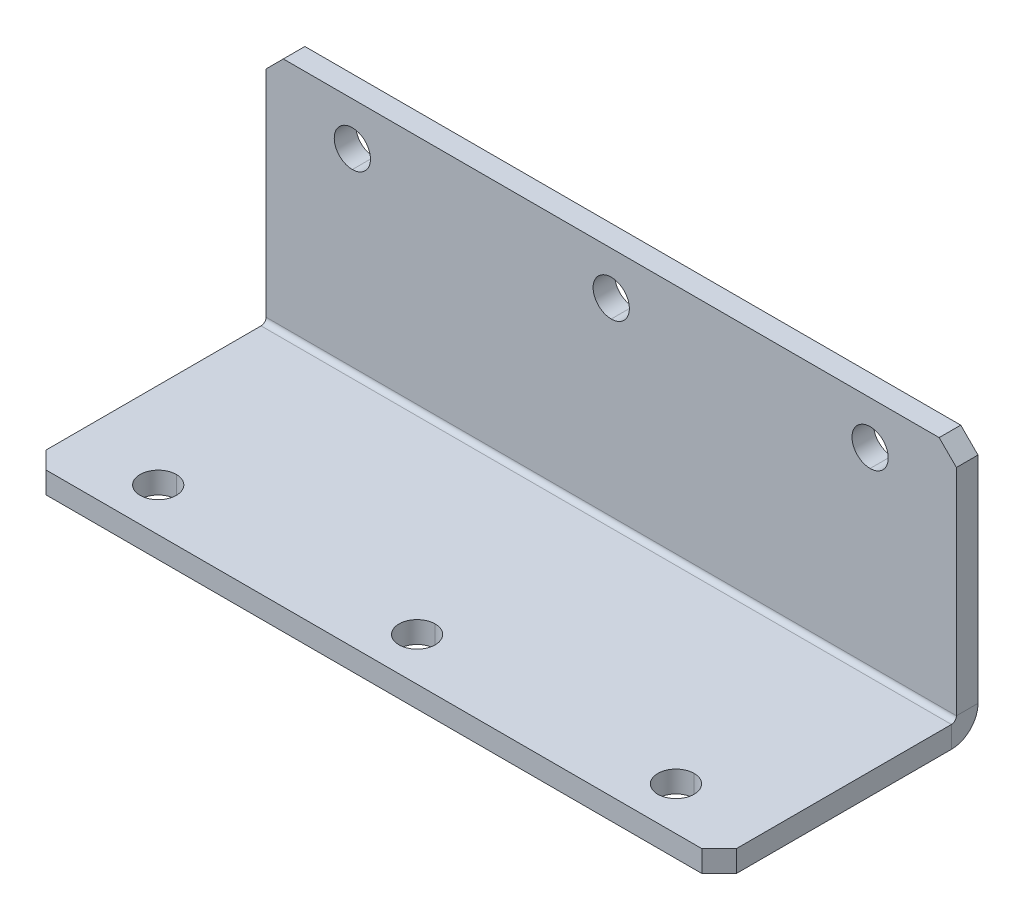
ISO-10303-21;
HEADER;
FILE_DESCRIPTION(('STEP AP214'),'2;1');
FILE_NAME('part.step','',(''),(''),'','','');
FILE_SCHEMA(('AUTOMOTIVE_DESIGN { 1 0 10303 214 1 1 1 1 }'));
ENDSEC;
DATA;
#1=APPLICATION_CONTEXT('core data for automotive mechanical design processes');
#2=APPLICATION_PROTOCOL_DEFINITION('international standard','automotive_design',2000,#1);
#3=PRODUCT_CONTEXT('',#1,'mechanical');
#4=PRODUCT('Part','Part','',(#3));
#5=PRODUCT_RELATED_PRODUCT_CATEGORY('part','',(#4));
#6=PRODUCT_DEFINITION_FORMATION('','',#4);
#7=PRODUCT_DEFINITION_CONTEXT('part definition',#1,'design');
#8=PRODUCT_DEFINITION('design','',#6,#7);
#9=PRODUCT_DEFINITION_SHAPE('','',#8);
#10=(LENGTH_UNIT() NAMED_UNIT(*) SI_UNIT(.MILLI.,.METRE.));
#11=(NAMED_UNIT(*) PLANE_ANGLE_UNIT() SI_UNIT($,.RADIAN.));
#12=(NAMED_UNIT(*) SI_UNIT($,.STERADIAN.) SOLID_ANGLE_UNIT());
#13=UNCERTAINTY_MEASURE_WITH_UNIT(LENGTH_MEASURE(1.E-05),#10,'distance_accuracy_value','');
#14=(GEOMETRIC_REPRESENTATION_CONTEXT(3) GLOBAL_UNCERTAINTY_ASSIGNED_CONTEXT((#13)) GLOBAL_UNIT_ASSIGNED_CONTEXT((#10,
#11,#12)) REPRESENTATION_CONTEXT('',''));
#15=CARTESIAN_POINT('',(0.,0.,0.));
#16=DIRECTION('',(0.,0.,1.));
#17=DIRECTION('',(1.,0.,0.));
#18=AXIS2_PLACEMENT_3D('',#15,#16,#17);
#19=CARTESIAN_POINT('',(88.9,28.575,0.));
#20=DIRECTION('',(0.,0.,-1.));
#21=DIRECTION('',(0.,1.,0.));
#22=AXIS2_PLACEMENT_3D('',#19,#20,#21);
#23=CYLINDRICAL_SURFACE('',#22,2.667);
#24=CARTESIAN_POINT('',(88.9,28.575,-34.925));
#25=DIRECTION('',(0.,0.,-1.));
#26=DIRECTION('',(1.,0.,0.));
#27=AXIS2_PLACEMENT_3D('',#24,#25,#26);
#28=CIRCLE('',#27,2.667);
#29=CARTESIAN_POINT('',(88.9,25.908,-34.925));
#30=VERTEX_POINT('',#29);
#31=CARTESIAN_POINT('',(88.9,31.242,-34.925));
#32=VERTEX_POINT('',#31);
#33=EDGE_CURVE('E41',#30,#32,#28,.T.);
#34=ORIENTED_EDGE('',*,*,#33,.F.);
#35=DIRECTION('',(0.,0.,-1.));
#36=VECTOR('',#35,1.);
#37=CARTESIAN_POINT('',(88.9,25.908,0.));
#38=LINE('',#37,#36);
#39=CARTESIAN_POINT('',(88.9,25.908,-38.1));
#40=VERTEX_POINT('',#39);
#41=EDGE_CURVE('E11',#30,#40,#38,.T.);
#42=ORIENTED_EDGE('',*,*,#41,.T.);
#43=CARTESIAN_POINT('',(88.9,28.575,-38.1));
#44=DIRECTION('',(0.,0.,1.));
#45=DIRECTION('',(0.,1.,0.));
#46=AXIS2_PLACEMENT_3D('',#43,#44,#45);
#47=CIRCLE('',#46,2.667);
#48=CARTESIAN_POINT('',(88.9,31.242,-38.1));
#49=VERTEX_POINT('',#48);
#50=EDGE_CURVE('E320',#49,#40,#47,.T.);
#51=ORIENTED_EDGE('',*,*,#50,.F.);
#52=DIRECTION('',(0.,0.,-1.));
#53=VECTOR('',#52,1.);
#54=CARTESIAN_POINT('',(88.9,31.242,0.));
#55=LINE('',#54,#53);
#56=EDGE_CURVE('E324',#32,#49,#55,.T.);
#57=ORIENTED_EDGE('',*,*,#56,.F.);
#58=EDGE_LOOP('',(#34,#42,#51,#57));
#59=FACE_BOUND('',#58,.T.);
#60=ADVANCED_FACE('F16',(#59),#23,.F.);
#61=CARTESIAN_POINT('',(12.7,28.575,0.));
#62=DIRECTION('',(0.,0.,-1.));
#63=DIRECTION('',(0.,1.,0.));
#64=AXIS2_PLACEMENT_3D('',#61,#62,#63);
#65=CYLINDRICAL_SURFACE('',#64,2.667);
#66=CARTESIAN_POINT('',(12.7,28.575,-34.925));
#67=DIRECTION('',(0.,0.,-1.));
#68=DIRECTION('',(1.,0.,0.));
#69=AXIS2_PLACEMENT_3D('',#66,#67,#68);
#70=CIRCLE('',#69,2.667);
#71=CARTESIAN_POINT('',(12.7,25.908,-34.925));
#72=VERTEX_POINT('',#71);
#73=CARTESIAN_POINT('',(12.7,31.242,-34.925));
#74=VERTEX_POINT('',#73);
#75=EDGE_CURVE('E20',#72,#74,#70,.T.);
#76=ORIENTED_EDGE('',*,*,#75,.F.);
#77=DIRECTION('',(0.,0.,-1.));
#78=VECTOR('',#77,1.);
#79=CARTESIAN_POINT('',(12.7,25.908,0.));
#80=LINE('',#79,#78);
#81=CARTESIAN_POINT('',(12.7,25.908,-38.1));
#82=VERTEX_POINT('',#81);
#83=EDGE_CURVE('E27',#72,#82,#80,.T.);
#84=ORIENTED_EDGE('',*,*,#83,.T.);
#85=CARTESIAN_POINT('',(12.7,28.575,-38.1));
#86=DIRECTION('',(0.,0.,1.));
#87=DIRECTION('',(0.,-1.,0.));
#88=AXIS2_PLACEMENT_3D('',#85,#86,#87);
#89=CIRCLE('',#88,2.667);
#90=CARTESIAN_POINT('',(12.7,31.242,-38.1));
#91=VERTEX_POINT('',#90);
#92=EDGE_CURVE('E332',#91,#82,#89,.T.);
#93=ORIENTED_EDGE('',*,*,#92,.F.);
#94=DIRECTION('',(0.,0.,-1.));
#95=VECTOR('',#94,1.);
#96=CARTESIAN_POINT('',(12.7,31.242,0.));
#97=LINE('',#96,#95);
#98=EDGE_CURVE('E305',#74,#91,#97,.T.);
#99=ORIENTED_EDGE('',*,*,#98,.F.);
#100=EDGE_LOOP('',(#76,#84,#93,#99));
#101=FACE_BOUND('',#100,.T.);
#102=ADVANCED_FACE('F533',(#101),#65,.F.);
#103=CARTESIAN_POINT('',(50.8,28.575,0.));
#104=DIRECTION('',(0.,0.,-1.));
#105=DIRECTION('',(0.,1.,0.));
#106=AXIS2_PLACEMENT_3D('',#103,#104,#105);
#107=CYLINDRICAL_SURFACE('',#106,2.667);
#108=CARTESIAN_POINT('',(50.8,28.575,-34.925));
#109=DIRECTION('',(0.,0.,-1.));
#110=DIRECTION('',(1.,0.,0.));
#111=AXIS2_PLACEMENT_3D('',#108,#109,#110);
#112=CIRCLE('',#111,2.667);
#113=CARTESIAN_POINT('',(50.8,25.908,-34.925));
#114=VERTEX_POINT('',#113);
#115=CARTESIAN_POINT('',(50.8,31.242,-34.925));
#116=VERTEX_POINT('',#115);
#117=EDGE_CURVE('E319',#114,#116,#112,.T.);
#118=ORIENTED_EDGE('',*,*,#117,.F.);
#119=DIRECTION('',(0.,0.,-1.));
#120=VECTOR('',#119,1.);
#121=CARTESIAN_POINT('',(50.8,25.908,0.));
#122=LINE('',#121,#120);
#123=CARTESIAN_POINT('',(50.8,25.908,-38.1));
#124=VERTEX_POINT('',#123);
#125=EDGE_CURVE('E271',#114,#124,#122,.T.);
#126=ORIENTED_EDGE('',*,*,#125,.T.);
#127=CARTESIAN_POINT('',(50.8,28.575,-38.1));
#128=DIRECTION('',(0.,0.,1.));
#129=DIRECTION('',(0.,-1.,0.));
#130=AXIS2_PLACEMENT_3D('',#127,#128,#129);
#131=CIRCLE('',#130,2.667);
#132=CARTESIAN_POINT('',(50.8,31.242,-38.1));
#133=VERTEX_POINT('',#132);
#134=EDGE_CURVE('E345',#133,#124,#131,.T.);
#135=ORIENTED_EDGE('',*,*,#134,.F.);
#136=DIRECTION('',(0.,0.,-1.));
#137=VECTOR('',#136,1.);
#138=CARTESIAN_POINT('',(50.8,31.242,0.));
#139=LINE('',#138,#137);
#140=EDGE_CURVE('E303',#116,#133,#139,.T.);
#141=ORIENTED_EDGE('',*,*,#140,.F.);
#142=EDGE_LOOP('',(#118,#126,#135,#141));
#143=FACE_BOUND('',#142,.T.);
#144=ADVANCED_FACE('F538',(#143),#107,.F.);
#145=CARTESIAN_POINT('',(88.9,34.925,-6.35));
#146=DIRECTION('',(0.,-1.,0.));
#147=DIRECTION('',(0.,0.,-1.));
#148=AXIS2_PLACEMENT_3D('',#145,#146,#147);
#149=CYLINDRICAL_SURFACE('',#148,2.667);
#150=CARTESIAN_POINT('',(88.9,0.,-6.35));
#151=DIRECTION('',(0.,1.,0.));
#152=DIRECTION('',(0.,0.,1.));
#153=AXIS2_PLACEMENT_3D('',#150,#151,#152);
#154=CIRCLE('',#153,2.667);
#155=CARTESIAN_POINT('',(88.9,0.,-9.017));
#156=VERTEX_POINT('',#155);
#157=CARTESIAN_POINT('',(88.9,0.,-3.683));
#158=VERTEX_POINT('',#157);
#159=EDGE_CURVE('E275',#156,#158,#154,.T.);
#160=ORIENTED_EDGE('',*,*,#159,.T.);
#161=DIRECTION('',(0.,-1.,0.));
#162=VECTOR('',#161,1.);
#163=CARTESIAN_POINT('',(88.9,34.925,-3.683));
#164=LINE('',#163,#162);
#165=CARTESIAN_POINT('',(88.9,-3.175,-3.683));
#166=VERTEX_POINT('',#165);
#167=EDGE_CURVE('E392',#158,#166,#164,.T.);
#168=ORIENTED_EDGE('',*,*,#167,.T.);
#169=CARTESIAN_POINT('',(88.9,-3.175,-6.35));
#170=DIRECTION('',(0.,-1.,0.));
#171=DIRECTION('',(0.,0.,1.));
#172=AXIS2_PLACEMENT_3D('',#169,#170,#171);
#173=CIRCLE('',#172,2.667);
#174=CARTESIAN_POINT('',(88.9,-3.175,-9.017));
#175=VERTEX_POINT('',#174);
#176=EDGE_CURVE('E280',#166,#175,#173,.T.);
#177=ORIENTED_EDGE('',*,*,#176,.T.);
#178=DIRECTION('',(0.,-1.,0.));
#179=VECTOR('',#178,1.);
#180=CARTESIAN_POINT('',(88.9,34.925,-9.017));
#181=LINE('',#180,#179);
#182=EDGE_CURVE('E260',#156,#175,#181,.T.);
#183=ORIENTED_EDGE('',*,*,#182,.F.);
#184=EDGE_LOOP('',(#160,#168,#177,#183));
#185=FACE_BOUND('',#184,.T.);
#186=ADVANCED_FACE('F580',(#185),#149,.F.);
#187=CARTESIAN_POINT('',(12.7,34.925,-6.35));
#188=DIRECTION('',(0.,-1.,0.));
#189=DIRECTION('',(0.,0.,-1.));
#190=AXIS2_PLACEMENT_3D('',#187,#188,#189);
#191=CYLINDRICAL_SURFACE('',#190,2.667);
#192=CARTESIAN_POINT('',(12.7,0.,-6.35));
#193=DIRECTION('',(0.,1.,0.));
#194=DIRECTION('',(0.,0.,1.));
#195=AXIS2_PLACEMENT_3D('',#192,#193,#194);
#196=CIRCLE('',#195,2.667);
#197=CARTESIAN_POINT('',(12.7,0.,-9.017));
#198=VERTEX_POINT('',#197);
#199=CARTESIAN_POINT('',(12.7,0.,-3.683));
#200=VERTEX_POINT('',#199);
#201=EDGE_CURVE('E276',#198,#200,#196,.T.);
#202=ORIENTED_EDGE('',*,*,#201,.T.);
#203=DIRECTION('',(0.,-1.,0.));
#204=VECTOR('',#203,1.);
#205=CARTESIAN_POINT('',(12.7,34.925,-3.683));
#206=LINE('',#205,#204);
#207=CARTESIAN_POINT('',(12.7,-3.175,-3.683));
#208=VERTEX_POINT('',#207);
#209=EDGE_CURVE('E281',#200,#208,#206,.T.);
#210=ORIENTED_EDGE('',*,*,#209,.T.);
#211=CARTESIAN_POINT('',(12.7,-3.175,-6.35));
#212=DIRECTION('',(0.,-1.,0.));
#213=DIRECTION('',(0.,0.,-1.));
#214=AXIS2_PLACEMENT_3D('',#211,#212,#213);
#215=CIRCLE('',#214,2.667);
#216=CARTESIAN_POINT('',(12.7,-3.175,-9.017));
#217=VERTEX_POINT('',#216);
#218=EDGE_CURVE('E368',#208,#217,#215,.T.);
#219=ORIENTED_EDGE('',*,*,#218,.T.);
#220=DIRECTION('',(0.,-1.,0.));
#221=VECTOR('',#220,1.);
#222=CARTESIAN_POINT('',(12.7,34.925,-9.017));
#223=LINE('',#222,#221);
#224=EDGE_CURVE('E443',#198,#217,#223,.T.);
#225=ORIENTED_EDGE('',*,*,#224,.F.);
#226=EDGE_LOOP('',(#202,#210,#219,#225));
#227=FACE_BOUND('',#226,.T.);
#228=ADVANCED_FACE('F497',(#227),#191,.F.);
#229=CARTESIAN_POINT('',(50.8,34.925,-6.35));
#230=DIRECTION('',(0.,-1.,0.));
#231=DIRECTION('',(0.,0.,-1.));
#232=AXIS2_PLACEMENT_3D('',#229,#230,#231);
#233=CYLINDRICAL_SURFACE('',#232,2.667);
#234=CARTESIAN_POINT('',(50.8,0.,-6.35));
#235=DIRECTION('',(0.,1.,0.));
#236=DIRECTION('',(0.,0.,1.));
#237=AXIS2_PLACEMENT_3D('',#234,#235,#236);
#238=CIRCLE('',#237,2.667);
#239=CARTESIAN_POINT('',(50.8,0.,-9.017));
#240=VERTEX_POINT('',#239);
#241=CARTESIAN_POINT('',(50.8,0.,-3.683));
#242=VERTEX_POINT('',#241);
#243=EDGE_CURVE('E371',#240,#242,#238,.T.);
#244=ORIENTED_EDGE('',*,*,#243,.T.);
#245=DIRECTION('',(0.,-1.,0.));
#246=VECTOR('',#245,1.);
#247=CARTESIAN_POINT('',(50.8,34.925,-3.683));
#248=LINE('',#247,#246);
#249=CARTESIAN_POINT('',(50.8,-3.175,-3.683));
#250=VERTEX_POINT('',#249);
#251=EDGE_CURVE('E385',#242,#250,#248,.T.);
#252=ORIENTED_EDGE('',*,*,#251,.T.);
#253=CARTESIAN_POINT('',(50.8,-3.175,-6.35));
#254=DIRECTION('',(0.,-1.,0.));
#255=DIRECTION('',(0.,0.,-1.));
#256=AXIS2_PLACEMENT_3D('',#253,#254,#255);
#257=CIRCLE('',#256,2.667);
#258=CARTESIAN_POINT('',(50.8,-3.175,-9.017));
#259=VERTEX_POINT('',#258);
#260=EDGE_CURVE('E381',#250,#259,#257,.T.);
#261=ORIENTED_EDGE('',*,*,#260,.T.);
#262=DIRECTION('',(0.,-1.,0.));
#263=VECTOR('',#262,1.);
#264=CARTESIAN_POINT('',(50.8,34.925,-9.017));
#265=LINE('',#264,#263);
#266=EDGE_CURVE('E269',#240,#259,#265,.T.);
#267=ORIENTED_EDGE('',*,*,#266,.F.);
#268=EDGE_LOOP('',(#244,#252,#261,#267));
#269=FACE_BOUND('',#268,.T.);
#270=ADVANCED_FACE('F515',(#269),#233,.F.);
#271=CARTESIAN_POINT('',(101.6,0.,-38.1));
#272=DIRECTION('',(0.,0.,1.));
#273=DIRECTION('',(1.,0.,0.));
#274=AXIS2_PLACEMENT_3D('',#271,#272,#273);
#275=PLANE('',#274);
#276=DIRECTION('',(0.,1.,0.));
#277=VECTOR('',#276,1.);
#278=CARTESIAN_POINT('',(0.,0.,-38.1));
#279=LINE('',#278,#277);
#280=CARTESIAN_POINT('',(0.,0.7366,-38.1));
#281=VERTEX_POINT('',#280);
#282=CARTESIAN_POINT('',(0.,32.385,-38.1));
#283=VERTEX_POINT('',#282);
#284=EDGE_CURVE('E352',#281,#283,#279,.T.);
#285=ORIENTED_EDGE('',*,*,#284,.T.);
#286=DIRECTION('',(0.707106781186548,0.707106781186548,0.));
#287=VECTOR('',#286,1.);
#288=CARTESIAN_POINT('',(0.,32.385,-38.1));
#289=LINE('',#288,#287);
#290=CARTESIAN_POINT('',(2.54,34.925,-38.1));
#291=VERTEX_POINT('',#290);
#292=EDGE_CURVE('E348',#283,#291,#289,.T.);
#293=ORIENTED_EDGE('',*,*,#292,.T.);
#294=DIRECTION('',(-1.,0.,0.));
#295=VECTOR('',#294,1.);
#296=CARTESIAN_POINT('',(101.6,34.925,-38.1));
#297=LINE('',#296,#295);
#298=CARTESIAN_POINT('',(99.06,34.925,-38.1));
#299=VERTEX_POINT('',#298);
#300=EDGE_CURVE('E343',#299,#291,#297,.T.);
#301=ORIENTED_EDGE('',*,*,#300,.F.);
#302=DIRECTION('',(0.707106781186544,-0.707106781186551,0.));
#303=VECTOR('',#302,1.);
#304=CARTESIAN_POINT('',(99.06,34.925,-38.1));
#305=LINE('',#304,#303);
#306=CARTESIAN_POINT('',(101.6,32.385,-38.1));
#307=VERTEX_POINT('',#306);
#308=EDGE_CURVE('E353',#299,#307,#305,.T.);
#309=ORIENTED_EDGE('',*,*,#308,.T.);
#310=DIRECTION('',(0.,1.,0.));
#311=VECTOR('',#310,1.);
#312=CARTESIAN_POINT('',(101.6,0.,-38.1));
#313=LINE('',#312,#311);
#314=CARTESIAN_POINT('',(101.6,0.7366,-38.1));
#315=VERTEX_POINT('',#314);
#316=EDGE_CURVE('E403',#315,#307,#313,.T.);
#317=ORIENTED_EDGE('',*,*,#316,.F.);
#318=DIRECTION('',(-1.,0.,0.));
#319=VECTOR('',#318,1.);
#320=CARTESIAN_POINT('',(101.6,0.7366,-38.1));
#321=LINE('',#320,#319);
#322=EDGE_CURVE('E335',#315,#281,#321,.T.);
#323=ORIENTED_EDGE('',*,*,#322,.T.);
#324=EDGE_LOOP('',(#285,#293,#301,#309,#317,#323));
#325=FACE_BOUND('',#324,.T.);
#326=ORIENTED_EDGE('',*,*,#92,.T.);
#327=CARTESIAN_POINT('',(12.7,28.575,-38.1));
#328=DIRECTION('',(0.,0.,1.));
#329=DIRECTION('',(0.,-1.,0.));
#330=AXIS2_PLACEMENT_3D('',#327,#328,#329);
#331=CIRCLE('',#330,2.667);
#332=EDGE_CURVE('E336',#82,#91,#331,.T.);
#333=ORIENTED_EDGE('',*,*,#332,.T.);
#334=EDGE_LOOP('',(#326,#333));
#335=FACE_BOUND('',#334,.T.);
#336=ORIENTED_EDGE('',*,*,#134,.T.);
#337=CARTESIAN_POINT('',(50.8,28.575,-38.1));
#338=DIRECTION('',(0.,0.,1.));
#339=DIRECTION('',(0.,-1.,0.));
#340=AXIS2_PLACEMENT_3D('',#337,#338,#339);
#341=CIRCLE('',#340,2.667);
#342=EDGE_CURVE('E323',#124,#133,#341,.T.);
#343=ORIENTED_EDGE('',*,*,#342,.T.);
#344=EDGE_LOOP('',(#336,#343));
#345=FACE_BOUND('',#344,.T.);
#346=ORIENTED_EDGE('',*,*,#50,.T.);
#347=CARTESIAN_POINT('',(88.9,28.575,-38.1));
#348=DIRECTION('',(0.,0.,1.));
#349=DIRECTION('',(0.,1.,0.));
#350=AXIS2_PLACEMENT_3D('',#347,#348,#349);
#351=CIRCLE('',#350,2.667);
#352=EDGE_CURVE('E310',#40,#49,#351,.T.);
#353=ORIENTED_EDGE('',*,*,#352,.T.);
#354=EDGE_LOOP('',(#346,#353));
#355=FACE_BOUND('',#354,.T.);
#356=ADVANCED_FACE('F548',(#325,#335,#345,#355),#275,.F.);
#357=CARTESIAN_POINT('',(101.6,0.,-34.925));
#358=DIRECTION('',(0.,0.,1.));
#359=DIRECTION('',(1.,0.,0.));
#360=AXIS2_PLACEMENT_3D('',#357,#358,#359);
#361=PLANE('',#360);
#362=DIRECTION('',(-1.,0.,0.));
#363=VECTOR('',#362,1.);
#364=CARTESIAN_POINT('',(101.6,34.925,-34.925));
#365=LINE('',#364,#363);
#366=CARTESIAN_POINT('',(99.06,34.925,-34.925));
#367=VERTEX_POINT('',#366);
#368=CARTESIAN_POINT('',(2.54000000000006,34.925,-34.925));
#369=VERTEX_POINT('',#368);
#370=EDGE_CURVE('E293',#367,#369,#365,.T.);
#371=ORIENTED_EDGE('',*,*,#370,.T.);
#372=DIRECTION('',(-0.707106781186548,-0.707106781186548,0.));
#373=VECTOR('',#372,1.);
#374=CARTESIAN_POINT('',(34.6075,66.9925,-34.925));
#375=LINE('',#374,#373);
#376=CARTESIAN_POINT('',(0.,32.385,-34.925));
#377=VERTEX_POINT('',#376);
#378=EDGE_CURVE('E289',#369,#377,#375,.T.);
#379=ORIENTED_EDGE('',*,*,#378,.T.);
#380=DIRECTION('',(0.,1.,0.));
#381=VECTOR('',#380,1.);
#382=CARTESIAN_POINT('',(0.,0.,-34.925));
#383=LINE('',#382,#381);
#384=CARTESIAN_POINT('',(0.,0.7366,-34.925));
#385=VERTEX_POINT('',#384);
#386=EDGE_CURVE('E464',#385,#377,#383,.T.);
#387=ORIENTED_EDGE('',*,*,#386,.F.);
#388=DIRECTION('',(-1.,0.,0.));
#389=VECTOR('',#388,1.);
#390=CARTESIAN_POINT('',(101.6,0.7366,-34.925));
#391=LINE('',#390,#389);
#392=CARTESIAN_POINT('',(101.6,0.7366,-34.925));
#393=VERTEX_POINT('',#392);
#394=EDGE_CURVE('E448',#393,#385,#391,.T.);
#395=ORIENTED_EDGE('',*,*,#394,.F.);
#396=DIRECTION('',(0.,1.,0.));
#397=VECTOR('',#396,1.);
#398=CARTESIAN_POINT('',(101.6,0.,-34.925));
#399=LINE('',#398,#397);
#400=CARTESIAN_POINT('',(101.6,32.385,-34.925));
#401=VERTEX_POINT('',#400);
#402=EDGE_CURVE('E294',#393,#401,#399,.T.);
#403=ORIENTED_EDGE('',*,*,#402,.T.);
#404=DIRECTION('',(-0.707106781186544,0.707106781186551,0.));
#405=VECTOR('',#404,1.);
#406=CARTESIAN_POINT('',(117.7925,16.1925,-34.925));
#407=LINE('',#406,#405);
#408=EDGE_CURVE('E331',#401,#367,#407,.T.);
#409=ORIENTED_EDGE('',*,*,#408,.T.);
#410=EDGE_LOOP('',(#371,#379,#387,#395,#403,#409));
#411=FACE_BOUND('',#410,.T.);
#412=CARTESIAN_POINT('',(12.7,28.575,-34.925));
#413=DIRECTION('',(0.,0.,-1.));
#414=DIRECTION('',(1.,0.,0.));
#415=AXIS2_PLACEMENT_3D('',#412,#413,#414);
#416=CIRCLE('',#415,2.667);
#417=EDGE_CURVE('E327',#74,#72,#416,.T.);
#418=ORIENTED_EDGE('',*,*,#417,.T.);
#419=ORIENTED_EDGE('',*,*,#75,.T.);
#420=EDGE_LOOP('',(#418,#419));
#421=FACE_BOUND('',#420,.T.);
#422=CARTESIAN_POINT('',(50.8,28.575,-34.925));
#423=DIRECTION('',(0.,0.,-1.));
#424=DIRECTION('',(1.,0.,0.));
#425=AXIS2_PLACEMENT_3D('',#422,#423,#424);
#426=CIRCLE('',#425,2.667);
#427=EDGE_CURVE('E315',#116,#114,#426,.T.);
#428=ORIENTED_EDGE('',*,*,#427,.T.);
#429=ORIENTED_EDGE('',*,*,#117,.T.);
#430=EDGE_LOOP('',(#428,#429));
#431=FACE_BOUND('',#430,.T.);
#432=CARTESIAN_POINT('',(88.9,28.575,-34.925));
#433=DIRECTION('',(0.,0.,-1.));
#434=DIRECTION('',(1.,0.,0.));
#435=AXIS2_PLACEMENT_3D('',#432,#433,#434);
#436=CIRCLE('',#435,2.667);
#437=EDGE_CURVE('E284',#32,#30,#436,.T.);
#438=ORIENTED_EDGE('',*,*,#437,.T.);
#439=ORIENTED_EDGE('',*,*,#33,.T.);
#440=EDGE_LOOP('',(#438,#439));
#441=FACE_BOUND('',#440,.T.);
#442=ADVANCED_FACE('F545',(#411,#421,#431,#441),#361,.T.);
#443=CARTESIAN_POINT('',(101.6,0.7366,-34.925));
#444=DIRECTION('',(1.,0.,0.));
#445=DIRECTION('',(0.,1.,0.));
#446=AXIS2_PLACEMENT_3D('',#443,#444,#445);
#447=PLANE('',#446);
#448=DIRECTION('',(0.,0.,-1.));
#449=VECTOR('',#448,1.);
#450=CARTESIAN_POINT('',(101.6,0.7366,-34.925));
#451=LINE('',#450,#449);
#452=EDGE_CURVE('E404',#393,#315,#451,.T.);
#453=ORIENTED_EDGE('',*,*,#452,.F.);
#454=CARTESIAN_POINT('',(101.6,0.7366,-34.1884));
#455=DIRECTION('',(1.,0.,0.));
#456=DIRECTION('',(0.,0.,1.));
#457=AXIS2_PLACEMENT_3D('',#454,#455,#456);
#458=CIRCLE('',#457,0.7366);
#459=CARTESIAN_POINT('',(101.6,0.,-34.1884));
#460=VERTEX_POINT('',#459);
#461=EDGE_CURVE('E360',#460,#393,#458,.T.);
#462=ORIENTED_EDGE('',*,*,#461,.F.);
#463=DIRECTION('',(0.,1.,0.));
#464=VECTOR('',#463,1.);
#465=CARTESIAN_POINT('',(101.6,-3.175,-34.1884));
#466=LINE('',#465,#464);
#467=CARTESIAN_POINT('',(101.6,-3.175,-34.1884));
#468=VERTEX_POINT('',#467);
#469=EDGE_CURVE('E220',#468,#460,#466,.T.);
#470=ORIENTED_EDGE('',*,*,#469,.F.);
#471=CARTESIAN_POINT('',(101.6,0.7366,-34.1884));
#472=DIRECTION('',(1.,0.,0.));
#473=DIRECTION('',(0.,0.,-1.));
#474=AXIS2_PLACEMENT_3D('',#471,#472,#473);
#475=CIRCLE('',#474,3.9116);
#476=EDGE_CURVE('E285',#468,#315,#475,.T.);
#477=ORIENTED_EDGE('',*,*,#476,.T.);
#478=EDGE_LOOP('',(#453,#462,#470,#477));
#479=FACE_BOUND('',#478,.T.);
#480=ADVANCED_FACE('F547',(#479),#447,.T.);
#481=CARTESIAN_POINT('',(101.6,-3.175,-34.1884));
#482=DIRECTION('',(1.,0.,0.));
#483=DIRECTION('',(0.,1.,0.));
#484=AXIS2_PLACEMENT_3D('',#481,#482,#483);
#485=PLANE('',#484);
#486=ORIENTED_EDGE('',*,*,#316,.T.);
#487=DIRECTION('',(0.,0.,1.));
#488=VECTOR('',#487,1.);
#489=CARTESIAN_POINT('',(101.6,32.385,-34.1884));
#490=LINE('',#489,#488);
#491=EDGE_CURVE('E399',#307,#401,#490,.T.);
#492=ORIENTED_EDGE('',*,*,#491,.T.);
#493=ORIENTED_EDGE('',*,*,#402,.F.);
#494=ORIENTED_EDGE('',*,*,#452,.T.);
#495=EDGE_LOOP('',(#486,#492,#493,#494));
#496=FACE_BOUND('',#495,.T.);
#497=ADVANCED_FACE('F564',(#496),#485,.T.);
#498=CARTESIAN_POINT('',(0.,0.,-34.1884));
#499=DIRECTION('',(-1.,0.,0.));
#500=DIRECTION('',(0.,0.,1.));
#501=AXIS2_PLACEMENT_3D('',#498,#499,#500);
#502=PLANE('',#501);
#503=DIRECTION('',(0.,-1.,0.));
#504=VECTOR('',#503,1.);
#505=CARTESIAN_POINT('',(0.,0.,-34.1884));
#506=LINE('',#505,#504);
#507=CARTESIAN_POINT('',(0.,0.,-34.1884));
#508=VERTEX_POINT('',#507);
#509=CARTESIAN_POINT('',(0.,-3.175,-34.1884));
#510=VERTEX_POINT('',#509);
#511=EDGE_CURVE('E416',#508,#510,#506,.T.);
#512=ORIENTED_EDGE('',*,*,#511,.F.);
#513=CARTESIAN_POINT('',(0.,0.7366,-34.1884));
#514=DIRECTION('',(1.,0.,0.));
#515=DIRECTION('',(0.,0.,1.));
#516=AXIS2_PLACEMENT_3D('',#513,#514,#515);
#517=CIRCLE('',#516,0.7366);
#518=EDGE_CURVE('E377',#508,#385,#517,.T.);
#519=ORIENTED_EDGE('',*,*,#518,.T.);
#520=DIRECTION('',(0.,0.,1.));
#521=VECTOR('',#520,1.);
#522=CARTESIAN_POINT('',(0.,0.7366,-38.1));
#523=LINE('',#522,#521);
#524=EDGE_CURVE('E423',#281,#385,#523,.T.);
#525=ORIENTED_EDGE('',*,*,#524,.F.);
#526=CARTESIAN_POINT('',(0.,0.7366,-34.1884));
#527=DIRECTION('',(1.,0.,0.));
#528=DIRECTION('',(0.,0.,-1.));
#529=AXIS2_PLACEMENT_3D('',#526,#527,#528);
#530=CIRCLE('',#529,3.9116);
#531=EDGE_CURVE('E254',#510,#281,#530,.T.);
#532=ORIENTED_EDGE('',*,*,#531,.F.);
#533=EDGE_LOOP('',(#512,#519,#525,#532));
#534=FACE_BOUND('',#533,.T.);
#535=ADVANCED_FACE('F567',(#534),#502,.T.);
#536=CARTESIAN_POINT('',(0.,0.7366,-38.1));
#537=DIRECTION('',(-1.,0.,0.));
#538=DIRECTION('',(0.,0.,1.));
#539=AXIS2_PLACEMENT_3D('',#536,#537,#538);
#540=PLANE('',#539);
#541=DIRECTION('',(0.,0.,-1.));
#542=VECTOR('',#541,1.);
#543=CARTESIAN_POINT('',(0.,-3.175,0.));
#544=LINE('',#543,#542);
#545=CARTESIAN_POINT('',(0.,-3.175,-2.54));
#546=VERTEX_POINT('',#545);
#547=EDGE_CURVE('E297',#546,#510,#544,.T.);
#548=ORIENTED_EDGE('',*,*,#547,.F.);
#549=DIRECTION('',(0.,1.,0.));
#550=VECTOR('',#549,1.);
#551=CARTESIAN_POINT('',(0.,0.7366,-2.54));
#552=LINE('',#551,#550);
#553=CARTESIAN_POINT('',(0.,0.,-2.54));
#554=VERTEX_POINT('',#553);
#555=EDGE_CURVE('E373',#546,#554,#552,.T.);
#556=ORIENTED_EDGE('',*,*,#555,.T.);
#557=DIRECTION('',(0.,0.,-1.));
#558=VECTOR('',#557,1.);
#559=CARTESIAN_POINT('',(0.,0.,0.));
#560=LINE('',#559,#558);
#561=EDGE_CURVE('E378',#554,#508,#560,.T.);
#562=ORIENTED_EDGE('',*,*,#561,.T.);
#563=ORIENTED_EDGE('',*,*,#511,.T.);
#564=EDGE_LOOP('',(#548,#556,#562,#563));
#565=FACE_BOUND('',#564,.T.);
#566=ADVANCED_FACE('F576',(#565),#540,.T.);
#567=CARTESIAN_POINT('',(101.6,34.925,-34.925));
#568=DIRECTION('',(0.,1.,0.));
#569=DIRECTION('',(1.,0.,0.));
#570=AXIS2_PLACEMENT_3D('',#567,#568,#569);
#571=PLANE('',#570);
#572=ORIENTED_EDGE('',*,*,#300,.T.);
#573=DIRECTION('',(0.,0.,1.));
#574=VECTOR('',#573,1.);
#575=CARTESIAN_POINT('',(2.54,34.925,-34.925));
#576=LINE('',#575,#574);
#577=EDGE_CURVE('E339',#291,#369,#576,.T.);
#578=ORIENTED_EDGE('',*,*,#577,.T.);
#579=ORIENTED_EDGE('',*,*,#370,.F.);
#580=DIRECTION('',(0.,0.,-1.));
#581=VECTOR('',#580,1.);
#582=CARTESIAN_POINT('',(99.06,34.925,-34.925));
#583=LINE('',#582,#581);
#584=EDGE_CURVE('E344',#367,#299,#583,.T.);
#585=ORIENTED_EDGE('',*,*,#584,.T.);
#586=EDGE_LOOP('',(#572,#578,#579,#585));
#587=FACE_BOUND('',#586,.T.);
#588=ADVANCED_FACE('F527',(#587),#571,.T.);
#589=CARTESIAN_POINT('',(101.6,0.7366,-34.1884));
#590=DIRECTION('',(-1.,0.,0.));
#591=DIRECTION('',(0.,0.,1.));
#592=AXIS2_PLACEMENT_3D('',#589,#590,#591);
#593=CYLINDRICAL_SURFACE('',#592,0.7366);
#594=ORIENTED_EDGE('',*,*,#518,.F.);
#595=DIRECTION('',(-1.,0.,0.));
#596=VECTOR('',#595,1.);
#597=CARTESIAN_POINT('',(101.6,0.,-34.1884));
#598=LINE('',#597,#596);
#599=EDGE_CURVE('E226',#460,#508,#598,.T.);
#600=ORIENTED_EDGE('',*,*,#599,.F.);
#601=ORIENTED_EDGE('',*,*,#461,.T.);
#602=ORIENTED_EDGE('',*,*,#394,.T.);
#603=EDGE_LOOP('',(#594,#600,#601,#602));
#604=FACE_BOUND('',#603,.T.);
#605=ADVANCED_FACE('F518',(#604),#593,.F.);
#606=CARTESIAN_POINT('',(101.6,0.,0.));
#607=DIRECTION('',(0.,1.,0.));
#608=DIRECTION('',(1.,0.,0.));
#609=AXIS2_PLACEMENT_3D('',#606,#607,#608);
#610=PLANE('',#609);
#611=ORIENTED_EDGE('',*,*,#561,.F.);
#612=DIRECTION('',(0.70710678118655,0.,0.707106781186546));
#613=VECTOR('',#612,1.);
#614=CARTESIAN_POINT('',(52.07,0.,49.53));
#615=LINE('',#614,#613);
#616=CARTESIAN_POINT('',(2.54,0.,0.));
#617=VERTEX_POINT('',#616);
#618=EDGE_CURVE('E238',#554,#617,#615,.T.);
#619=ORIENTED_EDGE('',*,*,#618,.T.);
#620=DIRECTION('',(-1.,0.,0.));
#621=VECTOR('',#620,1.);
#622=CARTESIAN_POINT('',(101.6,0.,0.));
#623=LINE('',#622,#621);
#624=CARTESIAN_POINT('',(99.06,0.,0.));
#625=VERTEX_POINT('',#624);
#626=EDGE_CURVE('E233',#625,#617,#623,.T.);
#627=ORIENTED_EDGE('',*,*,#626,.F.);
#628=DIRECTION('',(0.707106781186544,0.,-0.707106781186551));
#629=VECTOR('',#628,1.);
#630=CARTESIAN_POINT('',(100.33,0.,-1.27));
#631=LINE('',#630,#629);
#632=CARTESIAN_POINT('',(101.6,0.,-2.54));
#633=VERTEX_POINT('',#632);
#634=EDGE_CURVE('E225',#625,#633,#631,.T.);
#635=ORIENTED_EDGE('',*,*,#634,.T.);
#636=DIRECTION('',(0.,0.,-1.));
#637=VECTOR('',#636,1.);
#638=CARTESIAN_POINT('',(101.6,0.,0.));
#639=LINE('',#638,#637);
#640=EDGE_CURVE('E214',#633,#460,#639,.T.);
#641=ORIENTED_EDGE('',*,*,#640,.T.);
#642=ORIENTED_EDGE('',*,*,#599,.T.);
#643=EDGE_LOOP('',(#611,#619,#627,#635,#641,#642));
#644=FACE_BOUND('',#643,.T.);
#645=ORIENTED_EDGE('',*,*,#159,.F.);
#646=CARTESIAN_POINT('',(88.9,0.,-6.35));
#647=DIRECTION('',(0.,1.,0.));
#648=DIRECTION('',(0.,0.,1.));
#649=AXIS2_PLACEMENT_3D('',#646,#647,#648);
#650=CIRCLE('',#649,2.667);
#651=EDGE_CURVE('E263',#158,#156,#650,.T.);
#652=ORIENTED_EDGE('',*,*,#651,.F.);
#653=EDGE_LOOP('',(#645,#652));
#654=FACE_BOUND('',#653,.T.);
#655=ORIENTED_EDGE('',*,*,#201,.F.);
#656=CARTESIAN_POINT('',(12.7,0.,-6.35));
#657=DIRECTION('',(0.,1.,0.));
#658=DIRECTION('',(0.,0.,1.));
#659=AXIS2_PLACEMENT_3D('',#656,#657,#658);
#660=CIRCLE('',#659,2.667);
#661=EDGE_CURVE('E270',#200,#198,#660,.T.);
#662=ORIENTED_EDGE('',*,*,#661,.F.);
#663=EDGE_LOOP('',(#655,#662));
#664=FACE_BOUND('',#663,.T.);
#665=ORIENTED_EDGE('',*,*,#243,.F.);
#666=CARTESIAN_POINT('',(50.8,0.,-6.35));
#667=DIRECTION('',(0.,1.,0.));
#668=DIRECTION('',(0.,0.,1.));
#669=AXIS2_PLACEMENT_3D('',#666,#667,#668);
#670=CIRCLE('',#669,2.667);
#671=EDGE_CURVE('E288',#242,#240,#670,.T.);
#672=ORIENTED_EDGE('',*,*,#671,.F.);
#673=EDGE_LOOP('',(#665,#672));
#674=FACE_BOUND('',#673,.T.);
#675=ADVANCED_FACE('F229',(#644,#654,#664,#674),#610,.T.);
#676=CARTESIAN_POINT('',(101.6,-3.175,0.));
#677=DIRECTION('',(0.,0.,1.));
#678=DIRECTION('',(1.,0.,0.));
#679=AXIS2_PLACEMENT_3D('',#676,#677,#678);
#680=PLANE('',#679);
#681=ORIENTED_EDGE('',*,*,#626,.T.);
#682=DIRECTION('',(0.,-1.,0.));
#683=VECTOR('',#682,1.);
#684=CARTESIAN_POINT('',(2.54,-3.175,0.));
#685=LINE('',#684,#683);
#686=CARTESIAN_POINT('',(2.54000000000006,-3.175,0.));
#687=VERTEX_POINT('',#686);
#688=EDGE_CURVE('E298',#617,#687,#685,.T.);
#689=ORIENTED_EDGE('',*,*,#688,.T.);
#690=DIRECTION('',(-1.,0.,0.));
#691=VECTOR('',#690,1.);
#692=CARTESIAN_POINT('',(101.6,-3.175,0.));
#693=LINE('',#692,#691);
#694=CARTESIAN_POINT('',(99.06,-3.175,0.));
#695=VERTEX_POINT('',#694);
#696=EDGE_CURVE('E361',#695,#687,#693,.T.);
#697=ORIENTED_EDGE('',*,*,#696,.F.);
#698=DIRECTION('',(0.,1.,0.));
#699=VECTOR('',#698,1.);
#700=CARTESIAN_POINT('',(99.06,0.,0.));
#701=LINE('',#700,#699);
#702=EDGE_CURVE('E302',#695,#625,#701,.T.);
#703=ORIENTED_EDGE('',*,*,#702,.T.);
#704=EDGE_LOOP('',(#681,#689,#697,#703));
#705=FACE_BOUND('',#704,.T.);
#706=ADVANCED_FACE('F507',(#705),#680,.T.);
#707=CARTESIAN_POINT('',(101.6,-3.175,0.));
#708=DIRECTION('',(0.,1.,0.));
#709=DIRECTION('',(1.,0.,0.));
#710=AXIS2_PLACEMENT_3D('',#707,#708,#709);
#711=PLANE('',#710);
#712=ORIENTED_EDGE('',*,*,#696,.T.);
#713=DIRECTION('',(-0.70710678118655,0.,-0.707106781186546));
#714=VECTOR('',#713,1.);
#715=CARTESIAN_POINT('',(0.,-3.175,-2.54));
#716=LINE('',#715,#714);
#717=EDGE_CURVE('E364',#687,#546,#716,.T.);
#718=ORIENTED_EDGE('',*,*,#717,.T.);
#719=ORIENTED_EDGE('',*,*,#547,.T.);
#720=DIRECTION('',(-1.,0.,0.));
#721=VECTOR('',#720,1.);
#722=CARTESIAN_POINT('',(101.6,-3.175,-34.1884));
#723=LINE('',#722,#721);
#724=EDGE_CURVE('E245',#468,#510,#723,.T.);
#725=ORIENTED_EDGE('',*,*,#724,.F.);
#726=DIRECTION('',(0.,0.,-1.));
#727=VECTOR('',#726,1.);
#728=CARTESIAN_POINT('',(101.6,-3.175,0.));
#729=LINE('',#728,#727);
#730=CARTESIAN_POINT('',(101.6,-3.175,-2.54));
#731=VERTEX_POINT('',#730);
#732=EDGE_CURVE('E246',#731,#468,#729,.T.);
#733=ORIENTED_EDGE('',*,*,#732,.F.);
#734=DIRECTION('',(-0.707106781186544,0.,0.707106781186551));
#735=VECTOR('',#734,1.);
#736=CARTESIAN_POINT('',(99.06,-3.175,0.));
#737=LINE('',#736,#735);
#738=EDGE_CURVE('E243',#731,#695,#737,.T.);
#739=ORIENTED_EDGE('',*,*,#738,.T.);
#740=EDGE_LOOP('',(#712,#718,#719,#725,#733,#739));
#741=FACE_BOUND('',#740,.T.);
#742=CARTESIAN_POINT('',(88.9,-3.175,-6.35));
#743=DIRECTION('',(0.,-1.,0.));
#744=DIRECTION('',(0.,0.,1.));
#745=AXIS2_PLACEMENT_3D('',#742,#743,#744);
#746=CIRCLE('',#745,2.667);
#747=EDGE_CURVE('E264',#175,#166,#746,.T.);
#748=ORIENTED_EDGE('',*,*,#747,.F.);
#749=ORIENTED_EDGE('',*,*,#176,.F.);
#750=EDGE_LOOP('',(#748,#749));
#751=FACE_BOUND('',#750,.T.);
#752=CARTESIAN_POINT('',(12.7,-3.175,-6.35));
#753=DIRECTION('',(0.,-1.,0.));
#754=DIRECTION('',(0.,0.,-1.));
#755=AXIS2_PLACEMENT_3D('',#752,#753,#754);
#756=CIRCLE('',#755,2.667);
#757=EDGE_CURVE('E314',#217,#208,#756,.T.);
#758=ORIENTED_EDGE('',*,*,#757,.F.);
#759=ORIENTED_EDGE('',*,*,#218,.F.);
#760=EDGE_LOOP('',(#758,#759));
#761=FACE_BOUND('',#760,.T.);
#762=CARTESIAN_POINT('',(50.8,-3.175,-6.35));
#763=DIRECTION('',(0.,-1.,0.));
#764=DIRECTION('',(0.,0.,-1.));
#765=AXIS2_PLACEMENT_3D('',#762,#763,#764);
#766=CIRCLE('',#765,2.667);
#767=EDGE_CURVE('E265',#259,#250,#766,.T.);
#768=ORIENTED_EDGE('',*,*,#767,.F.);
#769=ORIENTED_EDGE('',*,*,#260,.F.);
#770=EDGE_LOOP('',(#768,#769));
#771=FACE_BOUND('',#770,.T.);
#772=ADVANCED_FACE('F18',(#741,#751,#761,#771),#711,.F.);
#773=CARTESIAN_POINT('',(101.6,0.7366,-34.1884));
#774=DIRECTION('',(-1.,0.,0.));
#775=DIRECTION('',(0.,0.,1.));
#776=AXIS2_PLACEMENT_3D('',#773,#774,#775);
#777=CYLINDRICAL_SURFACE('',#776,3.9116);
#778=ORIENTED_EDGE('',*,*,#531,.T.);
#779=ORIENTED_EDGE('',*,*,#322,.F.);
#780=ORIENTED_EDGE('',*,*,#476,.F.);
#781=ORIENTED_EDGE('',*,*,#724,.T.);
#782=EDGE_LOOP('',(#778,#779,#780,#781));
#783=FACE_BOUND('',#782,.T.);
#784=ADVANCED_FACE('F506',(#783),#777,.T.);
#785=CARTESIAN_POINT('',(101.6,0.7366,-34.1884));
#786=DIRECTION('',(-1.,0.,0.));
#787=DIRECTION('',(0.,0.,1.));
#788=AXIS2_PLACEMENT_3D('',#785,#786,#787);
#789=PLANE('',#788);
#790=ORIENTED_EDGE('',*,*,#640,.F.);
#791=DIRECTION('',(0.,-1.,0.));
#792=VECTOR('',#791,1.);
#793=CARTESIAN_POINT('',(101.6,-3.175,-2.54));
#794=LINE('',#793,#792);
#795=EDGE_CURVE('E219',#633,#731,#794,.T.);
#796=ORIENTED_EDGE('',*,*,#795,.T.);
#797=ORIENTED_EDGE('',*,*,#732,.T.);
#798=ORIENTED_EDGE('',*,*,#469,.T.);
#799=EDGE_LOOP('',(#790,#796,#797,#798));
#800=FACE_BOUND('',#799,.T.);
#801=ADVANCED_FACE('F216',(#800),#789,.F.);
#802=CARTESIAN_POINT('',(0.,0.7366,-34.1884));
#803=DIRECTION('',(-1.,0.,0.));
#804=DIRECTION('',(0.,0.,1.));
#805=AXIS2_PLACEMENT_3D('',#802,#803,#804);
#806=PLANE('',#805);
#807=ORIENTED_EDGE('',*,*,#386,.T.);
#808=DIRECTION('',(0.,0.,-1.));
#809=VECTOR('',#808,1.);
#810=CARTESIAN_POINT('',(0.,32.385,-34.1884));
#811=LINE('',#810,#809);
#812=EDGE_CURVE('E467',#377,#283,#811,.T.);
#813=ORIENTED_EDGE('',*,*,#812,.T.);
#814=ORIENTED_EDGE('',*,*,#284,.F.);
#815=ORIENTED_EDGE('',*,*,#524,.T.);
#816=EDGE_LOOP('',(#807,#813,#814,#815));
#817=FACE_BOUND('',#816,.T.);
#818=ADVANCED_FACE('F582',(#817),#806,.T.);
#819=CARTESIAN_POINT('',(0.,32.385,-34.1884));
#820=DIRECTION('',(0.707106781186548,-0.707106781186548,0.));
#821=DIRECTION('',(0.,0.,-1.));
#822=AXIS2_PLACEMENT_3D('',#819,#820,#821);
#823=PLANE('',#822);
#824=ORIENTED_EDGE('',*,*,#378,.F.);
#825=ORIENTED_EDGE('',*,*,#577,.F.);
#826=ORIENTED_EDGE('',*,*,#292,.F.);
#827=ORIENTED_EDGE('',*,*,#812,.F.);
#828=EDGE_LOOP('',(#824,#825,#826,#827));
#829=FACE_BOUND('',#828,.T.);
#830=ADVANCED_FACE('F572',(#829),#823,.F.);
#831=CARTESIAN_POINT('',(99.06,34.925,-34.925));
#832=DIRECTION('',(-0.707106781186552,-0.707106781186544,0.));
#833=DIRECTION('',(-0.707106781186544,0.707106781186552,0.));
#834=AXIS2_PLACEMENT_3D('',#831,#832,#833);
#835=PLANE('',#834);
#836=ORIENTED_EDGE('',*,*,#408,.F.);
#837=ORIENTED_EDGE('',*,*,#491,.F.);
#838=ORIENTED_EDGE('',*,*,#308,.F.);
#839=ORIENTED_EDGE('',*,*,#584,.F.);
#840=EDGE_LOOP('',(#836,#837,#838,#839));
#841=FACE_BOUND('',#840,.T.);
#842=ADVANCED_FACE('F569',(#841),#835,.F.);
#843=CARTESIAN_POINT('',(0.,0.7366,-2.54));
#844=DIRECTION('',(0.707106781186546,0.,-0.70710678118655));
#845=DIRECTION('',(0.,-1.,0.));
#846=AXIS2_PLACEMENT_3D('',#843,#844,#845);
#847=PLANE('',#846);
#848=ORIENTED_EDGE('',*,*,#717,.F.);
#849=ORIENTED_EDGE('',*,*,#688,.F.);
#850=ORIENTED_EDGE('',*,*,#618,.F.);
#851=ORIENTED_EDGE('',*,*,#555,.F.);
#852=EDGE_LOOP('',(#848,#849,#850,#851));
#853=FACE_BOUND('',#852,.T.);
#854=ADVANCED_FACE('F543',(#853),#847,.F.);
#855=CARTESIAN_POINT('',(99.06,-3.175,0.));
#856=DIRECTION('',(0.707106781186552,0.,0.707106781186544));
#857=DIRECTION('',(0.,-1.,0.));
#858=AXIS2_PLACEMENT_3D('',#855,#856,#857);
#859=PLANE('',#858);
#860=ORIENTED_EDGE('',*,*,#738,.F.);
#861=ORIENTED_EDGE('',*,*,#795,.F.);
#862=ORIENTED_EDGE('',*,*,#634,.F.);
#863=ORIENTED_EDGE('',*,*,#702,.F.);
#864=EDGE_LOOP('',(#860,#861,#862,#863));
#865=FACE_BOUND('',#864,.T.);
#866=ADVANCED_FACE('F241',(#865),#859,.T.);
#867=CARTESIAN_POINT('',(50.8,34.925,-6.35));
#868=DIRECTION('',(0.,-1.,0.));
#869=DIRECTION('',(0.,0.,-1.));
#870=AXIS2_PLACEMENT_3D('',#867,#868,#869);
#871=CYLINDRICAL_SURFACE('',#870,2.667);
#872=ORIENTED_EDGE('',*,*,#251,.F.);
#873=ORIENTED_EDGE('',*,*,#671,.T.);
#874=ORIENTED_EDGE('',*,*,#266,.T.);
#875=ORIENTED_EDGE('',*,*,#767,.T.);
#876=EDGE_LOOP('',(#872,#873,#874,#875));
#877=FACE_BOUND('',#876,.T.);
#878=ADVANCED_FACE('F511',(#877),#871,.F.);
#879=CARTESIAN_POINT('',(12.7,34.925,-6.35));
#880=DIRECTION('',(0.,-1.,0.));
#881=DIRECTION('',(0.,0.,-1.));
#882=AXIS2_PLACEMENT_3D('',#879,#880,#881);
#883=CYLINDRICAL_SURFACE('',#882,2.667);
#884=ORIENTED_EDGE('',*,*,#209,.F.);
#885=ORIENTED_EDGE('',*,*,#661,.T.);
#886=ORIENTED_EDGE('',*,*,#224,.T.);
#887=ORIENTED_EDGE('',*,*,#757,.T.);
#888=EDGE_LOOP('',(#884,#885,#886,#887));
#889=FACE_BOUND('',#888,.T.);
#890=ADVANCED_FACE('F502',(#889),#883,.F.);
#891=CARTESIAN_POINT('',(88.9,34.925,-6.35));
#892=DIRECTION('',(0.,-1.,0.));
#893=DIRECTION('',(0.,0.,-1.));
#894=AXIS2_PLACEMENT_3D('',#891,#892,#893);
#895=CYLINDRICAL_SURFACE('',#894,2.667);
#896=ORIENTED_EDGE('',*,*,#167,.F.);
#897=ORIENTED_EDGE('',*,*,#651,.T.);
#898=ORIENTED_EDGE('',*,*,#182,.T.);
#899=ORIENTED_EDGE('',*,*,#747,.T.);
#900=EDGE_LOOP('',(#896,#897,#898,#899));
#901=FACE_BOUND('',#900,.T.);
#902=ADVANCED_FACE('F558',(#901),#895,.F.);
#903=CARTESIAN_POINT('',(50.8,28.575,0.));
#904=DIRECTION('',(0.,0.,-1.));
#905=DIRECTION('',(0.,1.,0.));
#906=AXIS2_PLACEMENT_3D('',#903,#904,#905);
#907=CYLINDRICAL_SURFACE('',#906,2.667);
#908=ORIENTED_EDGE('',*,*,#125,.F.);
#909=ORIENTED_EDGE('',*,*,#427,.F.);
#910=ORIENTED_EDGE('',*,*,#140,.T.);
#911=ORIENTED_EDGE('',*,*,#342,.F.);
#912=EDGE_LOOP('',(#908,#909,#910,#911));
#913=FACE_BOUND('',#912,.T.);
#914=ADVANCED_FACE('F554',(#913),#907,.F.);
#915=CARTESIAN_POINT('',(12.7,28.575,0.));
#916=DIRECTION('',(0.,0.,-1.));
#917=DIRECTION('',(0.,1.,0.));
#918=AXIS2_PLACEMENT_3D('',#915,#916,#917);
#919=CYLINDRICAL_SURFACE('',#918,2.667);
#920=ORIENTED_EDGE('',*,*,#83,.F.);
#921=ORIENTED_EDGE('',*,*,#417,.F.);
#922=ORIENTED_EDGE('',*,*,#98,.T.);
#923=ORIENTED_EDGE('',*,*,#332,.F.);
#924=EDGE_LOOP('',(#920,#921,#922,#923));
#925=FACE_BOUND('',#924,.T.);
#926=ADVANCED_FACE('F557',(#925),#919,.F.);
#927=CARTESIAN_POINT('',(88.9,28.575,0.));
#928=DIRECTION('',(0.,0.,-1.));
#929=DIRECTION('',(0.,1.,0.));
#930=AXIS2_PLACEMENT_3D('',#927,#928,#929);
#931=CYLINDRICAL_SURFACE('',#930,2.667);
#932=ORIENTED_EDGE('',*,*,#41,.F.);
#933=ORIENTED_EDGE('',*,*,#437,.F.);
#934=ORIENTED_EDGE('',*,*,#56,.T.);
#935=ORIENTED_EDGE('',*,*,#352,.F.);
#936=EDGE_LOOP('',(#932,#933,#934,#935));
#937=FACE_BOUND('',#936,.T.);
#938=ADVANCED_FACE('F561',(#937),#931,.F.);
#939=CLOSED_SHELL('',(#60,#102,#144,#186,#228,#270,#356,#442,#480,#497,#535,#566,#588,#605,#675,
#706,#772,#784,#801,#818,#830,#842,#854,#866,#878,#890,#902,#914,#926,#938));
#940=MANIFOLD_SOLID_BREP('B1',#939);
#941=ADVANCED_BREP_SHAPE_REPRESENTATION('',(#18,#940),#14);
#942=SHAPE_DEFINITION_REPRESENTATION(#9,#941);
ENDSEC;
END-ISO-10303-21;
